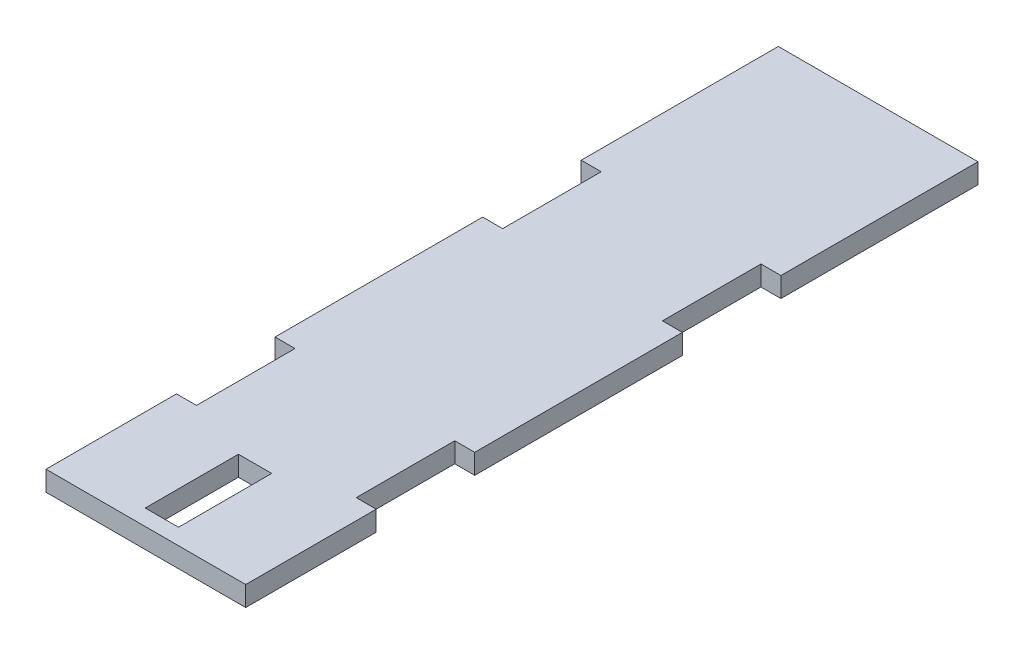
ISO-10303-21;
HEADER;
FILE_DESCRIPTION(('STEP AP214'),'2;1');
FILE_NAME('part.step','',(''),(''),'','','');
FILE_SCHEMA(('AUTOMOTIVE_DESIGN { 1 0 10303 214 1 1 1 1 }'));
ENDSEC;
DATA;
#1=APPLICATION_CONTEXT('core data for automotive mechanical design processes');
#2=APPLICATION_PROTOCOL_DEFINITION('international standard','automotive_design',2000,#1);
#3=PRODUCT_CONTEXT('',#1,'mechanical');
#4=PRODUCT('Part','Part','',(#3));
#5=PRODUCT_RELATED_PRODUCT_CATEGORY('part','',(#4));
#6=PRODUCT_DEFINITION_FORMATION('','',#4);
#7=PRODUCT_DEFINITION_CONTEXT('part definition',#1,'design');
#8=PRODUCT_DEFINITION('design','',#6,#7);
#9=PRODUCT_DEFINITION_SHAPE('','',#8);
#10=(LENGTH_UNIT() NAMED_UNIT(*) SI_UNIT(.MILLI.,.METRE.));
#11=(NAMED_UNIT(*) PLANE_ANGLE_UNIT() SI_UNIT($,.RADIAN.));
#12=(NAMED_UNIT(*) SI_UNIT($,.STERADIAN.) SOLID_ANGLE_UNIT());
#13=UNCERTAINTY_MEASURE_WITH_UNIT(LENGTH_MEASURE(1.E-05),#10,'distance_accuracy_value','');
#14=(GEOMETRIC_REPRESENTATION_CONTEXT(3) GLOBAL_UNCERTAINTY_ASSIGNED_CONTEXT((#13)) GLOBAL_UNIT_ASSIGNED_CONTEXT((#10,
#11,#12)) REPRESENTATION_CONTEXT('',''));
#15=CARTESIAN_POINT('',(0.,0.,0.));
#16=DIRECTION('',(0.,0.,1.));
#17=DIRECTION('',(1.,0.,0.));
#18=AXIS2_PLACEMENT_3D('',#15,#16,#17);
#19=CARTESIAN_POINT('',(15.,3.,-30.3972497252011));
#20=DIRECTION('',(-1.,0.,0.));
#21=DIRECTION('',(0.,0.,1.));
#22=AXIS2_PLACEMENT_3D('',#19,#20,#21);
#23=PLANE('',#22);
#24=DIRECTION('',(0.,0.,-1.));
#25=VECTOR('',#24,1.);
#26=CARTESIAN_POINT('',(15.,0.,-30.3972497252011));
#27=LINE('',#26,#25);
#28=CARTESIAN_POINT('',(15.,0.,-30.3972497252011));
#29=VERTEX_POINT('',#28);
#30=CARTESIAN_POINT('',(15.,0.,-60.));
#31=VERTEX_POINT('',#30);
#32=EDGE_CURVE('E250',#29,#31,#27,.T.);
#33=ORIENTED_EDGE('',*,*,#32,.T.);
#34=DIRECTION('',(0.,-1.,0.));
#35=VECTOR('',#34,1.);
#36=CARTESIAN_POINT('',(15.,3.,-60.));
#37=LINE('',#36,#35);
#38=CARTESIAN_POINT('',(15.,3.,-60.));
#39=VERTEX_POINT('',#38);
#40=EDGE_CURVE('E230',#39,#31,#37,.T.);
#41=ORIENTED_EDGE('',*,*,#40,.F.);
#42=DIRECTION('',(0.,0.,-1.));
#43=VECTOR('',#42,1.);
#44=CARTESIAN_POINT('',(15.,3.,-30.3972497252011));
#45=LINE('',#44,#43);
#46=CARTESIAN_POINT('',(15.,3.,-30.3972497252011));
#47=VERTEX_POINT('',#46);
#48=EDGE_CURVE('E251',#47,#39,#45,.T.);
#49=ORIENTED_EDGE('',*,*,#48,.F.);
#50=DIRECTION('',(0.,-1.,0.));
#51=VECTOR('',#50,1.);
#52=CARTESIAN_POINT('',(15.,3.,-30.3972497252011));
#53=LINE('',#52,#51);
#54=EDGE_CURVE('E309',#47,#29,#53,.T.);
#55=ORIENTED_EDGE('',*,*,#54,.T.);
#56=EDGE_LOOP('',(#33,#41,#49,#55));
#57=FACE_BOUND('',#56,.T.);
#58=ADVANCED_FACE('F39',(#57),#23,.F.);
#59=CARTESIAN_POINT('',(-15.,3.,-30.3972497252011));
#60=DIRECTION('',(1.,0.,0.));
#61=DIRECTION('',(0.,0.,-1.));
#62=AXIS2_PLACEMENT_3D('',#59,#60,#61);
#63=PLANE('',#62);
#64=DIRECTION('',(0.,0.,1.));
#65=VECTOR('',#64,1.);
#66=CARTESIAN_POINT('',(-15.,0.,-30.3972497252011));
#67=LINE('',#66,#65);
#68=CARTESIAN_POINT('',(-15.,0.,-60.));
#69=VERTEX_POINT('',#68);
#70=CARTESIAN_POINT('',(-15.,0.,-30.3972497252011));
#71=VERTEX_POINT('',#70);
#72=EDGE_CURVE('E312',#69,#71,#67,.T.);
#73=ORIENTED_EDGE('',*,*,#72,.T.);
#74=DIRECTION('',(0.,-1.,0.));
#75=VECTOR('',#74,1.);
#76=CARTESIAN_POINT('',(-15.,3.,-30.3972497252011));
#77=LINE('',#76,#75);
#78=CARTESIAN_POINT('',(-15.,3.,-30.3972497252011));
#79=VERTEX_POINT('',#78);
#80=EDGE_CURVE('E432',#79,#71,#77,.T.);
#81=ORIENTED_EDGE('',*,*,#80,.F.);
#82=DIRECTION('',(0.,0.,1.));
#83=VECTOR('',#82,1.);
#84=CARTESIAN_POINT('',(-15.,3.,-30.3972497252011));
#85=LINE('',#84,#83);
#86=CARTESIAN_POINT('',(-15.,3.,-60.));
#87=VERTEX_POINT('',#86);
#88=EDGE_CURVE('E254',#87,#79,#85,.T.);
#89=ORIENTED_EDGE('',*,*,#88,.F.);
#90=DIRECTION('',(0.,1.,0.));
#91=VECTOR('',#90,1.);
#92=CARTESIAN_POINT('',(-15.,0.,-60.));
#93=LINE('',#92,#91);
#94=EDGE_CURVE('E242',#69,#87,#93,.T.);
#95=ORIENTED_EDGE('',*,*,#94,.F.);
#96=EDGE_LOOP('',(#73,#81,#89,#95));
#97=FACE_BOUND('',#96,.T.);
#98=ADVANCED_FACE('F463',(#97),#63,.F.);
#99=CARTESIAN_POINT('',(-15.,3.,-30.3972497252011));
#100=DIRECTION('',(0.,0.,-1.));
#101=DIRECTION('',(-1.,0.,0.));
#102=AXIS2_PLACEMENT_3D('',#99,#100,#101);
#103=PLANE('',#102);
#104=DIRECTION('',(1.,0.,0.));
#105=VECTOR('',#104,1.);
#106=CARTESIAN_POINT('',(-15.,0.,-30.3972497252011));
#107=LINE('',#106,#105);
#108=CARTESIAN_POINT('',(-12.,0.,-30.3972497252011));
#109=VERTEX_POINT('',#108);
#110=EDGE_CURVE('E315',#71,#109,#107,.T.);
#111=ORIENTED_EDGE('',*,*,#110,.T.);
#112=DIRECTION('',(0.,-1.,0.));
#113=VECTOR('',#112,1.);
#114=CARTESIAN_POINT('',(-12.,3.,-30.3972497252011));
#115=LINE('',#114,#113);
#116=CARTESIAN_POINT('',(-12.,3.,-30.3972497252011));
#117=VERTEX_POINT('',#116);
#118=EDGE_CURVE('E428',#117,#109,#115,.T.);
#119=ORIENTED_EDGE('',*,*,#118,.F.);
#120=DIRECTION('',(1.,0.,0.));
#121=VECTOR('',#120,1.);
#122=CARTESIAN_POINT('',(-15.,3.,-30.3972497252011));
#123=LINE('',#122,#121);
#124=EDGE_CURVE('E258',#79,#117,#123,.T.);
#125=ORIENTED_EDGE('',*,*,#124,.F.);
#126=ORIENTED_EDGE('',*,*,#80,.T.);
#127=EDGE_LOOP('',(#111,#119,#125,#126));
#128=FACE_BOUND('',#127,.T.);
#129=ADVANCED_FACE('F468',(#128),#103,.F.);
#130=CARTESIAN_POINT('',(-12.,3.,-30.3972497252011));
#131=DIRECTION('',(1.,0.,0.));
#132=DIRECTION('',(0.,0.,-1.));
#133=AXIS2_PLACEMENT_3D('',#130,#131,#132);
#134=PLANE('',#133);
#135=DIRECTION('',(0.,0.,1.));
#136=VECTOR('',#135,1.);
#137=CARTESIAN_POINT('',(-12.,0.,-30.3972497252011));
#138=LINE('',#137,#136);
#139=CARTESIAN_POINT('',(-12.,0.,-15.5972497252011));
#140=VERTEX_POINT('',#139);
#141=EDGE_CURVE('E318',#109,#140,#138,.T.);
#142=ORIENTED_EDGE('',*,*,#141,.T.);
#143=DIRECTION('',(0.,-1.,0.));
#144=VECTOR('',#143,1.);
#145=CARTESIAN_POINT('',(-12.,3.,-15.5972497252011));
#146=LINE('',#145,#144);
#147=CARTESIAN_POINT('',(-12.,3.,-15.5972497252011));
#148=VERTEX_POINT('',#147);
#149=EDGE_CURVE('E424',#148,#140,#146,.T.);
#150=ORIENTED_EDGE('',*,*,#149,.F.);
#151=DIRECTION('',(0.,0.,1.));
#152=VECTOR('',#151,1.);
#153=CARTESIAN_POINT('',(-12.,3.,-30.3972497252011));
#154=LINE('',#153,#152);
#155=EDGE_CURVE('E261',#117,#148,#154,.T.);
#156=ORIENTED_EDGE('',*,*,#155,.F.);
#157=ORIENTED_EDGE('',*,*,#118,.T.);
#158=EDGE_LOOP('',(#142,#150,#156,#157));
#159=FACE_BOUND('',#158,.T.);
#160=ADVANCED_FACE('F557',(#159),#134,.F.);
#161=CARTESIAN_POINT('',(-15.,3.,-15.5972497252011));
#162=DIRECTION('',(0.,0.,1.));
#163=DIRECTION('',(1.,0.,0.));
#164=AXIS2_PLACEMENT_3D('',#161,#162,#163);
#165=PLANE('',#164);
#166=DIRECTION('',(-1.,0.,0.));
#167=VECTOR('',#166,1.);
#168=CARTESIAN_POINT('',(-15.,0.,-15.5972497252011));
#169=LINE('',#168,#167);
#170=CARTESIAN_POINT('',(-15.,0.,-15.5972497252011));
#171=VERTEX_POINT('',#170);
#172=EDGE_CURVE('E321',#140,#171,#169,.T.);
#173=ORIENTED_EDGE('',*,*,#172,.T.);
#174=DIRECTION('',(0.,-1.,0.));
#175=VECTOR('',#174,1.);
#176=CARTESIAN_POINT('',(-15.,3.,-15.5972497252011));
#177=LINE('',#176,#175);
#178=CARTESIAN_POINT('',(-15.,3.,-15.5972497252011));
#179=VERTEX_POINT('',#178);
#180=EDGE_CURVE('E420',#179,#171,#177,.T.);
#181=ORIENTED_EDGE('',*,*,#180,.F.);
#182=DIRECTION('',(-1.,0.,0.));
#183=VECTOR('',#182,1.);
#184=CARTESIAN_POINT('',(-15.,3.,-15.5972497252011));
#185=LINE('',#184,#183);
#186=EDGE_CURVE('E264',#148,#179,#185,.T.);
#187=ORIENTED_EDGE('',*,*,#186,.F.);
#188=ORIENTED_EDGE('',*,*,#149,.T.);
#189=EDGE_LOOP('',(#173,#181,#187,#188));
#190=FACE_BOUND('',#189,.T.);
#191=ADVANCED_FACE('F553',(#190),#165,.F.);
#192=CARTESIAN_POINT('',(-15.,3.,15.5972497252011));
#193=DIRECTION('',(1.,0.,0.));
#194=DIRECTION('',(0.,0.,-1.));
#195=AXIS2_PLACEMENT_3D('',#192,#193,#194);
#196=PLANE('',#195);
#197=DIRECTION('',(0.,0.,1.));
#198=VECTOR('',#197,1.);
#199=CARTESIAN_POINT('',(-15.,0.,15.5972497252011));
#200=LINE('',#199,#198);
#201=CARTESIAN_POINT('',(-15.,0.,15.5972497252011));
#202=VERTEX_POINT('',#201);
#203=EDGE_CURVE('E324',#171,#202,#200,.T.);
#204=ORIENTED_EDGE('',*,*,#203,.T.);
#205=DIRECTION('',(0.,-1.,0.));
#206=VECTOR('',#205,1.);
#207=CARTESIAN_POINT('',(-15.,3.,15.5972497252011));
#208=LINE('',#207,#206);
#209=CARTESIAN_POINT('',(-15.,3.,15.5972497252011));
#210=VERTEX_POINT('',#209);
#211=EDGE_CURVE('E416',#210,#202,#208,.T.);
#212=ORIENTED_EDGE('',*,*,#211,.F.);
#213=DIRECTION('',(0.,0.,1.));
#214=VECTOR('',#213,1.);
#215=CARTESIAN_POINT('',(-15.,3.,15.5972497252011));
#216=LINE('',#215,#214);
#217=EDGE_CURVE('E267',#179,#210,#216,.T.);
#218=ORIENTED_EDGE('',*,*,#217,.F.);
#219=ORIENTED_EDGE('',*,*,#180,.T.);
#220=EDGE_LOOP('',(#204,#212,#218,#219));
#221=FACE_BOUND('',#220,.T.);
#222=ADVANCED_FACE('F548',(#221),#196,.F.);
#223=CARTESIAN_POINT('',(-15.,3.,15.5972497252011));
#224=DIRECTION('',(0.,0.,-1.));
#225=DIRECTION('',(-1.,0.,0.));
#226=AXIS2_PLACEMENT_3D('',#223,#224,#225);
#227=PLANE('',#226);
#228=DIRECTION('',(1.,0.,0.));
#229=VECTOR('',#228,1.);
#230=CARTESIAN_POINT('',(-15.,0.,15.5972497252011));
#231=LINE('',#230,#229);
#232=CARTESIAN_POINT('',(-12.,0.,15.5972497252011));
#233=VERTEX_POINT('',#232);
#234=EDGE_CURVE('E327',#202,#233,#231,.T.);
#235=ORIENTED_EDGE('',*,*,#234,.T.);
#236=DIRECTION('',(0.,-1.,0.));
#237=VECTOR('',#236,1.);
#238=CARTESIAN_POINT('',(-12.,3.,15.5972497252011));
#239=LINE('',#238,#237);
#240=CARTESIAN_POINT('',(-12.,3.,15.5972497252011));
#241=VERTEX_POINT('',#240);
#242=EDGE_CURVE('E412',#241,#233,#239,.T.);
#243=ORIENTED_EDGE('',*,*,#242,.F.);
#244=DIRECTION('',(1.,0.,0.));
#245=VECTOR('',#244,1.);
#246=CARTESIAN_POINT('',(-15.,3.,15.5972497252011));
#247=LINE('',#246,#245);
#248=EDGE_CURVE('E270',#210,#241,#247,.T.);
#249=ORIENTED_EDGE('',*,*,#248,.F.);
#250=ORIENTED_EDGE('',*,*,#211,.T.);
#251=EDGE_LOOP('',(#235,#243,#249,#250));
#252=FACE_BOUND('',#251,.T.);
#253=ADVANCED_FACE('F542',(#252),#227,.F.);
#254=CARTESIAN_POINT('',(-12.,3.,30.3972497252011));
#255=DIRECTION('',(1.,0.,0.));
#256=DIRECTION('',(0.,0.,-1.));
#257=AXIS2_PLACEMENT_3D('',#254,#255,#256);
#258=PLANE('',#257);
#259=DIRECTION('',(0.,0.,1.));
#260=VECTOR('',#259,1.);
#261=CARTESIAN_POINT('',(-12.,0.,30.3972497252011));
#262=LINE('',#261,#260);
#263=CARTESIAN_POINT('',(-12.,0.,30.3972497252011));
#264=VERTEX_POINT('',#263);
#265=EDGE_CURVE('E330',#233,#264,#262,.T.);
#266=ORIENTED_EDGE('',*,*,#265,.T.);
#267=DIRECTION('',(0.,-1.,0.));
#268=VECTOR('',#267,1.);
#269=CARTESIAN_POINT('',(-12.,3.,30.3972497252011));
#270=LINE('',#269,#268);
#271=CARTESIAN_POINT('',(-12.,3.,30.3972497252011));
#272=VERTEX_POINT('',#271);
#273=EDGE_CURVE('E408',#272,#264,#270,.T.);
#274=ORIENTED_EDGE('',*,*,#273,.F.);
#275=DIRECTION('',(0.,0.,1.));
#276=VECTOR('',#275,1.);
#277=CARTESIAN_POINT('',(-12.,3.,30.3972497252011));
#278=LINE('',#277,#276);
#279=EDGE_CURVE('E273',#241,#272,#278,.T.);
#280=ORIENTED_EDGE('',*,*,#279,.F.);
#281=ORIENTED_EDGE('',*,*,#242,.T.);
#282=EDGE_LOOP('',(#266,#274,#280,#281));
#283=FACE_BOUND('',#282,.T.);
#284=ADVANCED_FACE('F538',(#283),#258,.F.);
#285=CARTESIAN_POINT('',(-15.,3.,30.3972497252011));
#286=DIRECTION('',(0.,0.,1.));
#287=DIRECTION('',(1.,0.,0.));
#288=AXIS2_PLACEMENT_3D('',#285,#286,#287);
#289=PLANE('',#288);
#290=DIRECTION('',(-1.,0.,0.));
#291=VECTOR('',#290,1.);
#292=CARTESIAN_POINT('',(-15.,0.,30.3972497252011));
#293=LINE('',#292,#291);
#294=CARTESIAN_POINT('',(-15.,0.,30.3972497252011));
#295=VERTEX_POINT('',#294);
#296=EDGE_CURVE('E333',#264,#295,#293,.T.);
#297=ORIENTED_EDGE('',*,*,#296,.T.);
#298=DIRECTION('',(0.,-1.,0.));
#299=VECTOR('',#298,1.);
#300=CARTESIAN_POINT('',(-15.,3.,30.3972497252011));
#301=LINE('',#300,#299);
#302=CARTESIAN_POINT('',(-15.,3.,30.3972497252011));
#303=VERTEX_POINT('',#302);
#304=EDGE_CURVE('E404',#303,#295,#301,.T.);
#305=ORIENTED_EDGE('',*,*,#304,.F.);
#306=DIRECTION('',(-1.,0.,0.));
#307=VECTOR('',#306,1.);
#308=CARTESIAN_POINT('',(-15.,3.,30.3972497252011));
#309=LINE('',#308,#307);
#310=EDGE_CURVE('E276',#272,#303,#309,.T.);
#311=ORIENTED_EDGE('',*,*,#310,.F.);
#312=ORIENTED_EDGE('',*,*,#273,.T.);
#313=EDGE_LOOP('',(#297,#305,#311,#312));
#314=FACE_BOUND('',#313,.T.);
#315=ADVANCED_FACE('F533',(#314),#289,.F.);
#316=CARTESIAN_POINT('',(-15.,3.,50.));
#317=DIRECTION('',(1.,0.,0.));
#318=DIRECTION('',(0.,0.,-1.));
#319=AXIS2_PLACEMENT_3D('',#316,#317,#318);
#320=PLANE('',#319);
#321=DIRECTION('',(0.,0.,1.));
#322=VECTOR('',#321,1.);
#323=CARTESIAN_POINT('',(-15.,0.,50.));
#324=LINE('',#323,#322);
#325=CARTESIAN_POINT('',(-15.,0.,50.));
#326=VERTEX_POINT('',#325);
#327=EDGE_CURVE('E336',#295,#326,#324,.T.);
#328=ORIENTED_EDGE('',*,*,#327,.T.);
#329=DIRECTION('',(0.,-1.,0.));
#330=VECTOR('',#329,1.);
#331=CARTESIAN_POINT('',(-15.,3.,50.));
#332=LINE('',#331,#330);
#333=CARTESIAN_POINT('',(-15.,3.,50.));
#334=VERTEX_POINT('',#333);
#335=EDGE_CURVE('E400',#334,#326,#332,.T.);
#336=ORIENTED_EDGE('',*,*,#335,.F.);
#337=DIRECTION('',(0.,0.,1.));
#338=VECTOR('',#337,1.);
#339=CARTESIAN_POINT('',(-15.,3.,50.));
#340=LINE('',#339,#338);
#341=EDGE_CURVE('E279',#303,#334,#340,.T.);
#342=ORIENTED_EDGE('',*,*,#341,.F.);
#343=ORIENTED_EDGE('',*,*,#304,.T.);
#344=EDGE_LOOP('',(#328,#336,#342,#343));
#345=FACE_BOUND('',#344,.T.);
#346=ADVANCED_FACE('F527',(#345),#320,.F.);
#347=CARTESIAN_POINT('',(-15.,3.,50.));
#348=DIRECTION('',(0.,0.,-1.));
#349=DIRECTION('',(-1.,0.,0.));
#350=AXIS2_PLACEMENT_3D('',#347,#348,#349);
#351=PLANE('',#350);
#352=DIRECTION('',(1.,0.,0.));
#353=VECTOR('',#352,1.);
#354=CARTESIAN_POINT('',(-15.,0.,50.));
#355=LINE('',#354,#353);
#356=CARTESIAN_POINT('',(15.,0.,50.));
#357=VERTEX_POINT('',#356);
#358=EDGE_CURVE('E339',#326,#357,#355,.T.);
#359=ORIENTED_EDGE('',*,*,#358,.T.);
#360=DIRECTION('',(0.,-1.,0.));
#361=VECTOR('',#360,1.);
#362=CARTESIAN_POINT('',(15.,3.,50.));
#363=LINE('',#362,#361);
#364=CARTESIAN_POINT('',(15.,3.,50.));
#365=VERTEX_POINT('',#364);
#366=EDGE_CURVE('E396',#365,#357,#363,.T.);
#367=ORIENTED_EDGE('',*,*,#366,.F.);
#368=DIRECTION('',(1.,0.,0.));
#369=VECTOR('',#368,1.);
#370=CARTESIAN_POINT('',(-15.,3.,50.));
#371=LINE('',#370,#369);
#372=EDGE_CURVE('E282',#334,#365,#371,.T.);
#373=ORIENTED_EDGE('',*,*,#372,.F.);
#374=ORIENTED_EDGE('',*,*,#335,.T.);
#375=EDGE_LOOP('',(#359,#367,#373,#374));
#376=FACE_BOUND('',#375,.T.);
#377=ADVANCED_FACE('F523',(#376),#351,.F.);
#378=CARTESIAN_POINT('',(15.,3.,50.));
#379=DIRECTION('',(-1.,0.,0.));
#380=DIRECTION('',(0.,0.,1.));
#381=AXIS2_PLACEMENT_3D('',#378,#379,#380);
#382=PLANE('',#381);
#383=DIRECTION('',(0.,0.,-1.));
#384=VECTOR('',#383,1.);
#385=CARTESIAN_POINT('',(15.,0.,50.));
#386=LINE('',#385,#384);
#387=CARTESIAN_POINT('',(15.,0.,30.3972497252011));
#388=VERTEX_POINT('',#387);
#389=EDGE_CURVE('E342',#357,#388,#386,.T.);
#390=ORIENTED_EDGE('',*,*,#389,.T.);
#391=DIRECTION('',(0.,-1.,0.));
#392=VECTOR('',#391,1.);
#393=CARTESIAN_POINT('',(15.,3.,30.3972497252011));
#394=LINE('',#393,#392);
#395=CARTESIAN_POINT('',(15.,3.,30.3972497252011));
#396=VERTEX_POINT('',#395);
#397=EDGE_CURVE('E392',#396,#388,#394,.T.);
#398=ORIENTED_EDGE('',*,*,#397,.F.);
#399=DIRECTION('',(0.,0.,-1.));
#400=VECTOR('',#399,1.);
#401=CARTESIAN_POINT('',(15.,3.,50.));
#402=LINE('',#401,#400);
#403=EDGE_CURVE('E285',#365,#396,#402,.T.);
#404=ORIENTED_EDGE('',*,*,#403,.F.);
#405=ORIENTED_EDGE('',*,*,#366,.T.);
#406=EDGE_LOOP('',(#390,#398,#404,#405));
#407=FACE_BOUND('',#406,.T.);
#408=ADVANCED_FACE('F518',(#407),#382,.F.);
#409=CARTESIAN_POINT('',(15.,3.,30.3972497252011));
#410=DIRECTION('',(0.,0.,1.));
#411=DIRECTION('',(1.,0.,0.));
#412=AXIS2_PLACEMENT_3D('',#409,#410,#411);
#413=PLANE('',#412);
#414=DIRECTION('',(-1.,0.,0.));
#415=VECTOR('',#414,1.);
#416=CARTESIAN_POINT('',(15.,0.,30.3972497252011));
#417=LINE('',#416,#415);
#418=CARTESIAN_POINT('',(12.,0.,30.3972497252011));
#419=VERTEX_POINT('',#418);
#420=EDGE_CURVE('E345',#388,#419,#417,.T.);
#421=ORIENTED_EDGE('',*,*,#420,.T.);
#422=DIRECTION('',(0.,-1.,0.));
#423=VECTOR('',#422,1.);
#424=CARTESIAN_POINT('',(12.,3.,30.3972497252011));
#425=LINE('',#424,#423);
#426=CARTESIAN_POINT('',(12.,3.,30.3972497252011));
#427=VERTEX_POINT('',#426);
#428=EDGE_CURVE('E388',#427,#419,#425,.T.);
#429=ORIENTED_EDGE('',*,*,#428,.F.);
#430=DIRECTION('',(-1.,0.,0.));
#431=VECTOR('',#430,1.);
#432=CARTESIAN_POINT('',(15.,3.,30.3972497252011));
#433=LINE('',#432,#431);
#434=EDGE_CURVE('E288',#396,#427,#433,.T.);
#435=ORIENTED_EDGE('',*,*,#434,.F.);
#436=ORIENTED_EDGE('',*,*,#397,.T.);
#437=EDGE_LOOP('',(#421,#429,#435,#436));
#438=FACE_BOUND('',#437,.T.);
#439=ADVANCED_FACE('F512',(#438),#413,.F.);
#440=CARTESIAN_POINT('',(12.,3.,30.3972497252011));
#441=DIRECTION('',(-1.,0.,0.));
#442=DIRECTION('',(0.,0.,1.));
#443=AXIS2_PLACEMENT_3D('',#440,#441,#442);
#444=PLANE('',#443);
#445=DIRECTION('',(0.,0.,-1.));
#446=VECTOR('',#445,1.);
#447=CARTESIAN_POINT('',(12.,0.,30.3972497252011));
#448=LINE('',#447,#446);
#449=CARTESIAN_POINT('',(12.,0.,15.5972497252011));
#450=VERTEX_POINT('',#449);
#451=EDGE_CURVE('E348',#419,#450,#448,.T.);
#452=ORIENTED_EDGE('',*,*,#451,.T.);
#453=DIRECTION('',(0.,-1.,0.));
#454=VECTOR('',#453,1.);
#455=CARTESIAN_POINT('',(12.,3.,15.5972497252011));
#456=LINE('',#455,#454);
#457=CARTESIAN_POINT('',(12.,3.,15.5972497252011));
#458=VERTEX_POINT('',#457);
#459=EDGE_CURVE('E384',#458,#450,#456,.T.);
#460=ORIENTED_EDGE('',*,*,#459,.F.);
#461=DIRECTION('',(0.,0.,-1.));
#462=VECTOR('',#461,1.);
#463=CARTESIAN_POINT('',(12.,3.,30.3972497252011));
#464=LINE('',#463,#462);
#465=EDGE_CURVE('E291',#427,#458,#464,.T.);
#466=ORIENTED_EDGE('',*,*,#465,.F.);
#467=ORIENTED_EDGE('',*,*,#428,.T.);
#468=EDGE_LOOP('',(#452,#460,#466,#467));
#469=FACE_BOUND('',#468,.T.);
#470=ADVANCED_FACE('F508',(#469),#444,.F.);
#471=CARTESIAN_POINT('',(15.,3.,15.5972497252011));
#472=DIRECTION('',(0.,0.,-1.));
#473=DIRECTION('',(-1.,0.,0.));
#474=AXIS2_PLACEMENT_3D('',#471,#472,#473);
#475=PLANE('',#474);
#476=DIRECTION('',(1.,0.,0.));
#477=VECTOR('',#476,1.);
#478=CARTESIAN_POINT('',(15.,0.,15.5972497252011));
#479=LINE('',#478,#477);
#480=CARTESIAN_POINT('',(15.,0.,15.5972497252011));
#481=VERTEX_POINT('',#480);
#482=EDGE_CURVE('E351',#450,#481,#479,.T.);
#483=ORIENTED_EDGE('',*,*,#482,.T.);
#484=DIRECTION('',(0.,-1.,0.));
#485=VECTOR('',#484,1.);
#486=CARTESIAN_POINT('',(15.,3.,15.5972497252011));
#487=LINE('',#486,#485);
#488=CARTESIAN_POINT('',(15.,3.,15.5972497252011));
#489=VERTEX_POINT('',#488);
#490=EDGE_CURVE('E380',#489,#481,#487,.T.);
#491=ORIENTED_EDGE('',*,*,#490,.F.);
#492=DIRECTION('',(1.,0.,0.));
#493=VECTOR('',#492,1.);
#494=CARTESIAN_POINT('',(15.,3.,15.5972497252011));
#495=LINE('',#494,#493);
#496=EDGE_CURVE('E294',#458,#489,#495,.T.);
#497=ORIENTED_EDGE('',*,*,#496,.F.);
#498=ORIENTED_EDGE('',*,*,#459,.T.);
#499=EDGE_LOOP('',(#483,#491,#497,#498));
#500=FACE_BOUND('',#499,.T.);
#501=ADVANCED_FACE('F503',(#500),#475,.F.);
#502=CARTESIAN_POINT('',(15.,3.,15.5972497252011));
#503=DIRECTION('',(-1.,0.,0.));
#504=DIRECTION('',(0.,0.,1.));
#505=AXIS2_PLACEMENT_3D('',#502,#503,#504);
#506=PLANE('',#505);
#507=DIRECTION('',(0.,0.,-1.));
#508=VECTOR('',#507,1.);
#509=CARTESIAN_POINT('',(15.,0.,15.5972497252011));
#510=LINE('',#509,#508);
#511=CARTESIAN_POINT('',(15.,0.,-15.5972497252011));
#512=VERTEX_POINT('',#511);
#513=EDGE_CURVE('E354',#481,#512,#510,.T.);
#514=ORIENTED_EDGE('',*,*,#513,.T.);
#515=DIRECTION('',(0.,-1.,0.));
#516=VECTOR('',#515,1.);
#517=CARTESIAN_POINT('',(15.,3.,-15.5972497252011));
#518=LINE('',#517,#516);
#519=CARTESIAN_POINT('',(15.,3.,-15.5972497252011));
#520=VERTEX_POINT('',#519);
#521=EDGE_CURVE('E376',#520,#512,#518,.T.);
#522=ORIENTED_EDGE('',*,*,#521,.F.);
#523=DIRECTION('',(0.,0.,-1.));
#524=VECTOR('',#523,1.);
#525=CARTESIAN_POINT('',(15.,3.,15.5972497252011));
#526=LINE('',#525,#524);
#527=EDGE_CURVE('E297',#489,#520,#526,.T.);
#528=ORIENTED_EDGE('',*,*,#527,.F.);
#529=ORIENTED_EDGE('',*,*,#490,.T.);
#530=EDGE_LOOP('',(#514,#522,#528,#529));
#531=FACE_BOUND('',#530,.T.);
#532=ADVANCED_FACE('F497',(#531),#506,.F.);
#533=CARTESIAN_POINT('',(15.,3.,-15.5972497252011));
#534=DIRECTION('',(0.,0.,1.));
#535=DIRECTION('',(1.,0.,0.));
#536=AXIS2_PLACEMENT_3D('',#533,#534,#535);
#537=PLANE('',#536);
#538=DIRECTION('',(-1.,0.,0.));
#539=VECTOR('',#538,1.);
#540=CARTESIAN_POINT('',(15.,0.,-15.5972497252011));
#541=LINE('',#540,#539);
#542=CARTESIAN_POINT('',(12.,0.,-15.5972497252011));
#543=VERTEX_POINT('',#542);
#544=EDGE_CURVE('E357',#512,#543,#541,.T.);
#545=ORIENTED_EDGE('',*,*,#544,.T.);
#546=DIRECTION('',(0.,-1.,0.));
#547=VECTOR('',#546,1.);
#548=CARTESIAN_POINT('',(12.,3.,-15.5972497252011));
#549=LINE('',#548,#547);
#550=CARTESIAN_POINT('',(12.,3.,-15.5972497252011));
#551=VERTEX_POINT('',#550);
#552=EDGE_CURVE('E372',#551,#543,#549,.T.);
#553=ORIENTED_EDGE('',*,*,#552,.F.);
#554=DIRECTION('',(-1.,0.,0.));
#555=VECTOR('',#554,1.);
#556=CARTESIAN_POINT('',(15.,3.,-15.5972497252011));
#557=LINE('',#556,#555);
#558=EDGE_CURVE('E300',#520,#551,#557,.T.);
#559=ORIENTED_EDGE('',*,*,#558,.F.);
#560=ORIENTED_EDGE('',*,*,#521,.T.);
#561=EDGE_LOOP('',(#545,#553,#559,#560));
#562=FACE_BOUND('',#561,.T.);
#563=ADVANCED_FACE('F493',(#562),#537,.F.);
#564=CARTESIAN_POINT('',(12.,3.,-30.3972497252011));
#565=DIRECTION('',(-1.,0.,0.));
#566=DIRECTION('',(0.,0.,1.));
#567=AXIS2_PLACEMENT_3D('',#564,#565,#566);
#568=PLANE('',#567);
#569=DIRECTION('',(0.,0.,-1.));
#570=VECTOR('',#569,1.);
#571=CARTESIAN_POINT('',(12.,0.,-30.3972497252011));
#572=LINE('',#571,#570);
#573=CARTESIAN_POINT('',(12.,0.,-30.3972497252011));
#574=VERTEX_POINT('',#573);
#575=EDGE_CURVE('E360',#543,#574,#572,.T.);
#576=ORIENTED_EDGE('',*,*,#575,.T.);
#577=DIRECTION('',(0.,-1.,0.));
#578=VECTOR('',#577,1.);
#579=CARTESIAN_POINT('',(12.,3.,-30.3972497252011));
#580=LINE('',#579,#578);
#581=CARTESIAN_POINT('',(12.,3.,-30.3972497252011));
#582=VERTEX_POINT('',#581);
#583=EDGE_CURVE('E368',#582,#574,#580,.T.);
#584=ORIENTED_EDGE('',*,*,#583,.F.);
#585=DIRECTION('',(0.,0.,-1.));
#586=VECTOR('',#585,1.);
#587=CARTESIAN_POINT('',(12.,3.,-30.3972497252011));
#588=LINE('',#587,#586);
#589=EDGE_CURVE('E303',#551,#582,#588,.T.);
#590=ORIENTED_EDGE('',*,*,#589,.F.);
#591=ORIENTED_EDGE('',*,*,#552,.T.);
#592=EDGE_LOOP('',(#576,#584,#590,#591));
#593=FACE_BOUND('',#592,.T.);
#594=ADVANCED_FACE('F489',(#593),#568,.F.);
#595=CARTESIAN_POINT('',(15.,3.,-30.3972497252011));
#596=DIRECTION('',(0.,0.,-1.));
#597=DIRECTION('',(-1.,0.,0.));
#598=AXIS2_PLACEMENT_3D('',#595,#596,#597);
#599=PLANE('',#598);
#600=DIRECTION('',(1.,0.,0.));
#601=VECTOR('',#600,1.);
#602=CARTESIAN_POINT('',(15.,0.,-30.3972497252011));
#603=LINE('',#602,#601);
#604=EDGE_CURVE('E255',#574,#29,#603,.T.);
#605=ORIENTED_EDGE('',*,*,#604,.T.);
#606=ORIENTED_EDGE('',*,*,#54,.F.);
#607=DIRECTION('',(1.,0.,0.));
#608=VECTOR('',#607,1.);
#609=CARTESIAN_POINT('',(15.,3.,-30.3972497252011));
#610=LINE('',#609,#608);
#611=EDGE_CURVE('E306',#582,#47,#610,.T.);
#612=ORIENTED_EDGE('',*,*,#611,.F.);
#613=ORIENTED_EDGE('',*,*,#583,.T.);
#614=EDGE_LOOP('',(#605,#606,#612,#613));
#615=FACE_BOUND('',#614,.T.);
#616=ADVANCED_FACE('F484',(#615),#599,.F.);
#617=CARTESIAN_POINT('',(0.,3.,0.));
#618=DIRECTION('',(0.,-1.,0.));
#619=DIRECTION('',(0.,0.,-1.));
#620=AXIS2_PLACEMENT_3D('',#617,#618,#619);
#621=PLANE('',#620);
#622=DIRECTION('',(1.,0.,0.));
#623=VECTOR('',#622,1.);
#624=CARTESIAN_POINT('',(-2.5,3.,47.5972497252011));
#625=LINE('',#624,#623);
#626=CARTESIAN_POINT('',(-2.5,3.,47.5972497252011));
#627=VERTEX_POINT('',#626);
#628=CARTESIAN_POINT('',(2.5,3.,47.5972497252011));
#629=VERTEX_POINT('',#628);
#630=EDGE_CURVE('E212',#627,#629,#625,.T.);
#631=ORIENTED_EDGE('',*,*,#630,.F.);
#632=DIRECTION('',(0.,0.,1.));
#633=VECTOR('',#632,1.);
#634=CARTESIAN_POINT('',(-2.5,3.,47.5972497252011));
#635=LINE('',#634,#633);
#636=CARTESIAN_POINT('',(-2.5,3.,33.5972497252011));
#637=VERTEX_POINT('',#636);
#638=EDGE_CURVE('E54',#637,#627,#635,.T.);
#639=ORIENTED_EDGE('',*,*,#638,.F.);
#640=DIRECTION('',(-1.,0.,0.));
#641=VECTOR('',#640,1.);
#642=CARTESIAN_POINT('',(-2.5,3.,33.5972497252011));
#643=LINE('',#642,#641);
#644=CARTESIAN_POINT('',(2.5,3.,33.5972497252011));
#645=VERTEX_POINT('',#644);
#646=EDGE_CURVE('E220',#645,#637,#643,.T.);
#647=ORIENTED_EDGE('',*,*,#646,.F.);
#648=DIRECTION('',(0.,0.,-1.));
#649=VECTOR('',#648,1.);
#650=CARTESIAN_POINT('',(2.5,3.,47.5972497252011));
#651=LINE('',#650,#649);
#652=EDGE_CURVE('E202',#629,#645,#651,.T.);
#653=ORIENTED_EDGE('',*,*,#652,.F.);
#654=EDGE_LOOP('',(#631,#639,#647,#653));
#655=FACE_BOUND('',#654,.T.);
#656=ORIENTED_EDGE('',*,*,#48,.T.);
#657=DIRECTION('',(1.,0.,0.));
#658=VECTOR('',#657,1.);
#659=CARTESIAN_POINT('',(-15.,3.,-60.));
#660=LINE('',#659,#658);
#661=EDGE_CURVE('E246',#87,#39,#660,.T.);
#662=ORIENTED_EDGE('',*,*,#661,.F.);
#663=ORIENTED_EDGE('',*,*,#88,.T.);
#664=ORIENTED_EDGE('',*,*,#124,.T.);
#665=ORIENTED_EDGE('',*,*,#155,.T.);
#666=ORIENTED_EDGE('',*,*,#186,.T.);
#667=ORIENTED_EDGE('',*,*,#217,.T.);
#668=ORIENTED_EDGE('',*,*,#248,.T.);
#669=ORIENTED_EDGE('',*,*,#279,.T.);
#670=ORIENTED_EDGE('',*,*,#310,.T.);
#671=ORIENTED_EDGE('',*,*,#341,.T.);
#672=ORIENTED_EDGE('',*,*,#372,.T.);
#673=ORIENTED_EDGE('',*,*,#403,.T.);
#674=ORIENTED_EDGE('',*,*,#434,.T.);
#675=ORIENTED_EDGE('',*,*,#465,.T.);
#676=ORIENTED_EDGE('',*,*,#496,.T.);
#677=ORIENTED_EDGE('',*,*,#527,.T.);
#678=ORIENTED_EDGE('',*,*,#558,.T.);
#679=ORIENTED_EDGE('',*,*,#589,.T.);
#680=ORIENTED_EDGE('',*,*,#611,.T.);
#681=EDGE_LOOP('',(#656,#662,#663,#664,#665,#666,#667,#668,#669,#670,#671,#672,#673,#674,#675,
#676,#677,#678,#679,#680));
#682=FACE_BOUND('',#681,.T.);
#683=ADVANCED_FACE('F217',(#655,#682),#621,.F.);
#684=CARTESIAN_POINT('',(0.,0.,0.));
#685=DIRECTION('',(0.,-1.,0.));
#686=DIRECTION('',(0.,0.,-1.));
#687=AXIS2_PLACEMENT_3D('',#684,#685,#686);
#688=PLANE('',#687);
#689=DIRECTION('',(0.,0.,-1.));
#690=VECTOR('',#689,1.);
#691=CARTESIAN_POINT('',(-2.5,0.,0.));
#692=LINE('',#691,#690);
#693=CARTESIAN_POINT('',(-2.5,0.,47.5972497252011));
#694=VERTEX_POINT('',#693);
#695=CARTESIAN_POINT('',(-2.5,0.,33.5972497252011));
#696=VERTEX_POINT('',#695);
#697=EDGE_CURVE('E11',#694,#696,#692,.T.);
#698=ORIENTED_EDGE('',*,*,#697,.F.);
#699=DIRECTION('',(-1.,0.,0.));
#700=VECTOR('',#699,1.);
#701=CARTESIAN_POINT('',(0.,0.,47.5972497252011));
#702=LINE('',#701,#700);
#703=CARTESIAN_POINT('',(2.5,0.,47.5972497252011));
#704=VERTEX_POINT('',#703);
#705=EDGE_CURVE('E436',#704,#694,#702,.T.);
#706=ORIENTED_EDGE('',*,*,#705,.F.);
#707=DIRECTION('',(0.,0.,1.));
#708=VECTOR('',#707,1.);
#709=CARTESIAN_POINT('',(2.5,0.,0.));
#710=LINE('',#709,#708);
#711=CARTESIAN_POINT('',(2.5,0.,33.5972497252011));
#712=VERTEX_POINT('',#711);
#713=EDGE_CURVE('E205',#712,#704,#710,.T.);
#714=ORIENTED_EDGE('',*,*,#713,.F.);
#715=DIRECTION('',(1.,0.,0.));
#716=VECTOR('',#715,1.);
#717=CARTESIAN_POINT('',(0.,0.,33.5972497252011));
#718=LINE('',#717,#716);
#719=EDGE_CURVE('E47',#696,#712,#718,.T.);
#720=ORIENTED_EDGE('',*,*,#719,.F.);
#721=EDGE_LOOP('',(#698,#706,#714,#720));
#722=FACE_BOUND('',#721,.T.);
#723=ORIENTED_EDGE('',*,*,#32,.F.);
#724=ORIENTED_EDGE('',*,*,#604,.F.);
#725=ORIENTED_EDGE('',*,*,#575,.F.);
#726=ORIENTED_EDGE('',*,*,#544,.F.);
#727=ORIENTED_EDGE('',*,*,#513,.F.);
#728=ORIENTED_EDGE('',*,*,#482,.F.);
#729=ORIENTED_EDGE('',*,*,#451,.F.);
#730=ORIENTED_EDGE('',*,*,#420,.F.);
#731=ORIENTED_EDGE('',*,*,#389,.F.);
#732=ORIENTED_EDGE('',*,*,#358,.F.);
#733=ORIENTED_EDGE('',*,*,#327,.F.);
#734=ORIENTED_EDGE('',*,*,#296,.F.);
#735=ORIENTED_EDGE('',*,*,#265,.F.);
#736=ORIENTED_EDGE('',*,*,#234,.F.);
#737=ORIENTED_EDGE('',*,*,#203,.F.);
#738=ORIENTED_EDGE('',*,*,#172,.F.);
#739=ORIENTED_EDGE('',*,*,#141,.F.);
#740=ORIENTED_EDGE('',*,*,#110,.F.);
#741=ORIENTED_EDGE('',*,*,#72,.F.);
#742=DIRECTION('',(-1.,0.,0.));
#743=VECTOR('',#742,1.);
#744=CARTESIAN_POINT('',(15.,0.,-60.));
#745=LINE('',#744,#743);
#746=EDGE_CURVE('E238',#31,#69,#745,.T.);
#747=ORIENTED_EDGE('',*,*,#746,.F.);
#748=EDGE_LOOP('',(#723,#724,#725,#726,#727,#728,#729,#730,#731,#732,#733,#734,#735,#736,#737,
#738,#739,#740,#741,#747));
#749=FACE_BOUND('',#748,.T.);
#750=ADVANCED_FACE('F447',(#722,#749),#688,.T.);
#751=CARTESIAN_POINT('',(0.,0.,-60.));
#752=DIRECTION('',(0.,0.,-1.));
#753=DIRECTION('',(-1.,0.,0.));
#754=AXIS2_PLACEMENT_3D('',#751,#752,#753);
#755=PLANE('',#754);
#756=ORIENTED_EDGE('',*,*,#40,.T.);
#757=ORIENTED_EDGE('',*,*,#746,.T.);
#758=ORIENTED_EDGE('',*,*,#94,.T.);
#759=ORIENTED_EDGE('',*,*,#661,.T.);
#760=EDGE_LOOP('',(#756,#757,#758,#759));
#761=FACE_BOUND('',#760,.T.);
#762=ADVANCED_FACE('F452',(#761),#755,.T.);
#763=CARTESIAN_POINT('',(-2.5,-7.,47.5972497252011));
#764=DIRECTION('',(-1.,0.,0.));
#765=DIRECTION('',(0.,0.,1.));
#766=AXIS2_PLACEMENT_3D('',#763,#764,#765);
#767=PLANE('',#766);
#768=ORIENTED_EDGE('',*,*,#697,.T.);
#769=DIRECTION('',(0.,1.,0.));
#770=VECTOR('',#769,1.);
#771=CARTESIAN_POINT('',(-2.5,-7.,33.5972497252011));
#772=LINE('',#771,#770);
#773=EDGE_CURVE('E227',#696,#637,#772,.T.);
#774=ORIENTED_EDGE('',*,*,#773,.T.);
#775=ORIENTED_EDGE('',*,*,#638,.T.);
#776=DIRECTION('',(0.,1.,0.));
#777=VECTOR('',#776,1.);
#778=CARTESIAN_POINT('',(-2.5,-7.,47.5972497252011));
#779=LINE('',#778,#777);
#780=EDGE_CURVE('E209',#694,#627,#779,.T.);
#781=ORIENTED_EDGE('',*,*,#780,.F.);
#782=EDGE_LOOP('',(#768,#774,#775,#781));
#783=FACE_BOUND('',#782,.T.);
#784=ADVANCED_FACE('F449',(#783),#767,.F.);
#785=CARTESIAN_POINT('',(-2.5,-7.,33.5972497252011));
#786=DIRECTION('',(0.,0.,-1.));
#787=DIRECTION('',(-1.,0.,0.));
#788=AXIS2_PLACEMENT_3D('',#785,#786,#787);
#789=PLANE('',#788);
#790=ORIENTED_EDGE('',*,*,#719,.T.);
#791=DIRECTION('',(0.,1.,0.));
#792=VECTOR('',#791,1.);
#793=CARTESIAN_POINT('',(2.5,-7.,33.5972497252011));
#794=LINE('',#793,#792);
#795=EDGE_CURVE('E208',#712,#645,#794,.T.);
#796=ORIENTED_EDGE('',*,*,#795,.T.);
#797=ORIENTED_EDGE('',*,*,#646,.T.);
#798=ORIENTED_EDGE('',*,*,#773,.F.);
#799=EDGE_LOOP('',(#790,#796,#797,#798));
#800=FACE_BOUND('',#799,.T.);
#801=ADVANCED_FACE('F444',(#800),#789,.F.);
#802=CARTESIAN_POINT('',(2.5,-7.,47.5972497252011));
#803=DIRECTION('',(1.,0.,0.));
#804=DIRECTION('',(0.,0.,-1.));
#805=AXIS2_PLACEMENT_3D('',#802,#803,#804);
#806=PLANE('',#805);
#807=ORIENTED_EDGE('',*,*,#713,.T.);
#808=DIRECTION('',(0.,1.,0.));
#809=VECTOR('',#808,1.);
#810=CARTESIAN_POINT('',(2.5,-7.,47.5972497252011));
#811=LINE('',#810,#809);
#812=EDGE_CURVE('E62',#704,#629,#811,.T.);
#813=ORIENTED_EDGE('',*,*,#812,.T.);
#814=ORIENTED_EDGE('',*,*,#652,.T.);
#815=ORIENTED_EDGE('',*,*,#795,.F.);
#816=EDGE_LOOP('',(#807,#813,#814,#815));
#817=FACE_BOUND('',#816,.T.);
#818=ADVANCED_FACE('F199',(#817),#806,.F.);
#819=CARTESIAN_POINT('',(-2.5,-7.,47.5972497252011));
#820=DIRECTION('',(0.,0.,1.));
#821=DIRECTION('',(1.,0.,0.));
#822=AXIS2_PLACEMENT_3D('',#819,#820,#821);
#823=PLANE('',#822);
#824=ORIENTED_EDGE('',*,*,#705,.T.);
#825=ORIENTED_EDGE('',*,*,#780,.T.);
#826=ORIENTED_EDGE('',*,*,#630,.T.);
#827=ORIENTED_EDGE('',*,*,#812,.F.);
#828=EDGE_LOOP('',(#824,#825,#826,#827));
#829=FACE_BOUND('',#828,.T.);
#830=ADVANCED_FACE('F213',(#829),#823,.F.);
#831=CLOSED_SHELL('',(#58,#98,#129,#160,#191,#222,#253,#284,#315,#346,#377,#408,#439,#470,#501,
#532,#563,#594,#616,#683,#750,#762,#784,#801,#818,#830));
#832=MANIFOLD_SOLID_BREP('B2',#831);
#833=ADVANCED_BREP_SHAPE_REPRESENTATION('',(#18,#832),#14);
#834=SHAPE_DEFINITION_REPRESENTATION(#9,#833);
ENDSEC;
END-ISO-10303-21;
